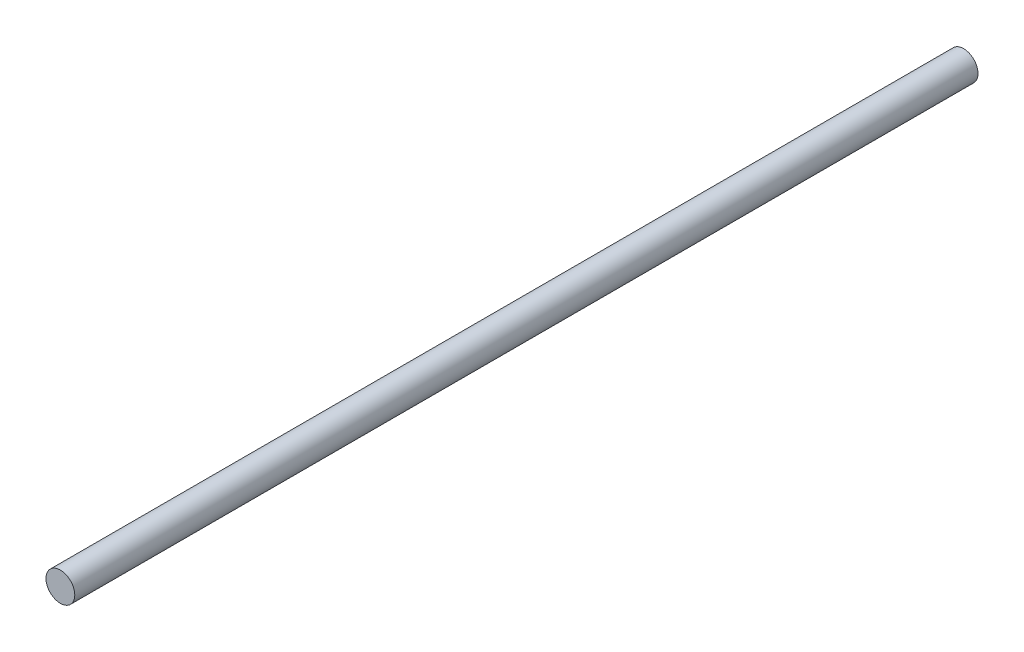
ISO-10303-21;
HEADER;
FILE_DESCRIPTION(('STEP AP214'),'2;1');
FILE_NAME('part.step','',(''),(''),'','','');
FILE_SCHEMA(('AUTOMOTIVE_DESIGN { 1 0 10303 214 1 1 1 1 }'));
ENDSEC;
DATA;
#1=APPLICATION_CONTEXT('core data for automotive mechanical design processes');
#2=APPLICATION_PROTOCOL_DEFINITION('international standard','automotive_design',2000,#1);
#3=PRODUCT_CONTEXT('',#1,'mechanical');
#4=PRODUCT('Part','Part','',(#3));
#5=PRODUCT_RELATED_PRODUCT_CATEGORY('part','',(#4));
#6=PRODUCT_DEFINITION_FORMATION('','',#4);
#7=PRODUCT_DEFINITION_CONTEXT('part definition',#1,'design');
#8=PRODUCT_DEFINITION('design','',#6,#7);
#9=PRODUCT_DEFINITION_SHAPE('','',#8);
#10=(LENGTH_UNIT() NAMED_UNIT(*) SI_UNIT(.MILLI.,.METRE.));
#11=(NAMED_UNIT(*) PLANE_ANGLE_UNIT() SI_UNIT($,.RADIAN.));
#12=(NAMED_UNIT(*) SI_UNIT($,.STERADIAN.) SOLID_ANGLE_UNIT());
#13=UNCERTAINTY_MEASURE_WITH_UNIT(LENGTH_MEASURE(1.E-05),#10,'distance_accuracy_value','');
#14=(GEOMETRIC_REPRESENTATION_CONTEXT(3) GLOBAL_UNCERTAINTY_ASSIGNED_CONTEXT((#13)) GLOBAL_UNIT_ASSIGNED_CONTEXT((#10,
#11,#12)) REPRESENTATION_CONTEXT('',''));
#15=CARTESIAN_POINT('',(0.,0.,0.));
#16=DIRECTION('',(0.,0.,1.));
#17=DIRECTION('',(1.,0.,0.));
#18=AXIS2_PLACEMENT_3D('',#15,#16,#17);
#19=CARTESIAN_POINT('',(0.,0.,832.121024484276));
#20=DIRECTION('',(0.,0.,-1.));
#21=DIRECTION('',(-1.,0.,0.));
#22=AXIS2_PLACEMENT_3D('',#19,#20,#21);
#23=CYLINDRICAL_SURFACE('',#22,12.7);
#24=CARTESIAN_POINT('',(0.,0.,0.));
#25=DIRECTION('',(0.,0.,1.));
#26=DIRECTION('',(1.,0.,0.));
#27=AXIS2_PLACEMENT_3D('',#24,#25,#26);
#28=CIRCLE('',#27,12.7);
#29=CARTESIAN_POINT('',(12.7,0.,0.));
#30=VERTEX_POINT('',#29);
#31=EDGE_CURVE('E43',#30,#30,#28,.T.);
#32=ORIENTED_EDGE('',*,*,#31,.T.);
#33=EDGE_LOOP('',(#32));
#34=FACE_BOUND('',#33,.T.);
#35=CARTESIAN_POINT('',(0.,0.,796.2));
#36=DIRECTION('',(0.,0.,1.));
#37=DIRECTION('',(1.,0.,0.));
#38=AXIS2_PLACEMENT_3D('',#35,#36,#37);
#39=CIRCLE('',#38,12.7);
#40=CARTESIAN_POINT('',(12.7,0.,796.2));
#41=VERTEX_POINT('',#40);
#42=EDGE_CURVE('E10',#41,#41,#39,.T.);
#43=ORIENTED_EDGE('',*,*,#42,.F.);
#44=EDGE_LOOP('',(#43));
#45=FACE_BOUND('',#44,.T.);
#46=ADVANCED_FACE('F35',(#34,#45),#23,.T.);
#47=CARTESIAN_POINT('',(0.,0.,0.));
#48=DIRECTION('',(0.,0.,1.));
#49=DIRECTION('',(1.,0.,0.));
#50=AXIS2_PLACEMENT_3D('',#47,#48,#49);
#51=PLANE('',#50);
#52=ORIENTED_EDGE('',*,*,#31,.F.);
#53=EDGE_LOOP('',(#52));
#54=FACE_BOUND('',#53,.T.);
#55=ADVANCED_FACE('F51',(#54),#51,.F.);
#56=CARTESIAN_POINT('',(-3.33066907387547E-13,7.7715611723761E-13,796.2));
#57=DIRECTION('',(0.,0.,1.));
#58=DIRECTION('',(0.250827261591988,0.968031861480945,0.));
#59=AXIS2_PLACEMENT_3D('',#56,#57,#58);
#60=PLANE('',#59);
#61=ORIENTED_EDGE('',*,*,#42,.T.);
#62=EDGE_LOOP('',(#61));
#63=FACE_BOUND('',#62,.T.);
#64=ADVANCED_FACE('F37',(#63),#60,.T.);
#65=CLOSED_SHELL('',(#46,#55,#64));
#66=MANIFOLD_SOLID_BREP('B2',#65);
#67=ADVANCED_BREP_SHAPE_REPRESENTATION('',(#18,#66),#14);
#68=SHAPE_DEFINITION_REPRESENTATION(#9,#67);
ENDSEC;
END-ISO-10303-21;
